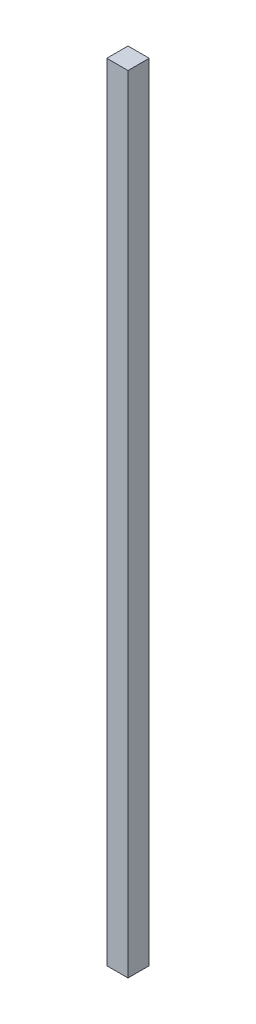
ISO-10303-21;
HEADER;
FILE_DESCRIPTION(('STEP AP214'),'2;1');
FILE_NAME('part.step','',(''),(''),'','','');
FILE_SCHEMA(('AUTOMOTIVE_DESIGN { 1 0 10303 214 1 1 1 1 }'));
ENDSEC;
DATA;
#1=APPLICATION_CONTEXT('core data for automotive mechanical design processes');
#2=APPLICATION_PROTOCOL_DEFINITION('international standard','automotive_design',2000,#1);
#3=PRODUCT_CONTEXT('',#1,'mechanical');
#4=PRODUCT('Part','Part','',(#3));
#5=PRODUCT_RELATED_PRODUCT_CATEGORY('part','',(#4));
#6=PRODUCT_DEFINITION_FORMATION('','',#4);
#7=PRODUCT_DEFINITION_CONTEXT('part definition',#1,'design');
#8=PRODUCT_DEFINITION('design','',#6,#7);
#9=PRODUCT_DEFINITION_SHAPE('','',#8);
#10=(LENGTH_UNIT() NAMED_UNIT(*) SI_UNIT(.MILLI.,.METRE.));
#11=(NAMED_UNIT(*) PLANE_ANGLE_UNIT() SI_UNIT($,.RADIAN.));
#12=(NAMED_UNIT(*) SI_UNIT($,.STERADIAN.) SOLID_ANGLE_UNIT());
#13=UNCERTAINTY_MEASURE_WITH_UNIT(LENGTH_MEASURE(1.E-05),#10,'distance_accuracy_value','');
#14=(GEOMETRIC_REPRESENTATION_CONTEXT(3) GLOBAL_UNCERTAINTY_ASSIGNED_CONTEXT((#13)) GLOBAL_UNIT_ASSIGNED_CONTEXT((#10,
#11,#12)) REPRESENTATION_CONTEXT('',''));
#15=CARTESIAN_POINT('',(0.,0.,0.));
#16=DIRECTION('',(0.,0.,1.));
#17=DIRECTION('',(1.,0.,0.));
#18=AXIS2_PLACEMENT_3D('',#15,#16,#17);
#19=CARTESIAN_POINT('',(0.,-370.,10.));
#20=DIRECTION('',(1.,0.,0.));
#21=DIRECTION('',(0.,0.,-1.));
#22=AXIS2_PLACEMENT_3D('',#19,#20,#21);
#23=PLANE('',#22);
#24=DIRECTION('',(0.,-1.,0.));
#25=VECTOR('',#24,1.);
#26=CARTESIAN_POINT('',(0.,-370.,0.));
#27=LINE('',#26,#25);
#28=CARTESIAN_POINT('',(0.,0.,0.));
#29=VERTEX_POINT('',#28);
#30=CARTESIAN_POINT('',(0.,-370.,0.));
#31=VERTEX_POINT('',#30);
#32=EDGE_CURVE('E107',#29,#31,#27,.T.);
#33=ORIENTED_EDGE('',*,*,#32,.T.);
#34=DIRECTION('',(0.,0.,-1.));
#35=VECTOR('',#34,1.);
#36=CARTESIAN_POINT('',(0.,-370.,10.));
#37=LINE('',#36,#35);
#38=CARTESIAN_POINT('',(0.,-370.,10.));
#39=VERTEX_POINT('',#38);
#40=EDGE_CURVE('E11',#39,#31,#37,.T.);
#41=ORIENTED_EDGE('',*,*,#40,.F.);
#42=DIRECTION('',(0.,-1.,0.));
#43=VECTOR('',#42,1.);
#44=CARTESIAN_POINT('',(0.,-370.,10.));
#45=LINE('',#44,#43);
#46=CARTESIAN_POINT('',(0.,0.,10.));
#47=VERTEX_POINT('',#46);
#48=EDGE_CURVE('E91',#47,#39,#45,.T.);
#49=ORIENTED_EDGE('',*,*,#48,.F.);
#50=DIRECTION('',(0.,0.,-1.));
#51=VECTOR('',#50,1.);
#52=CARTESIAN_POINT('',(0.,0.,10.));
#53=LINE('',#52,#51);
#54=EDGE_CURVE('E103',#47,#29,#53,.T.);
#55=ORIENTED_EDGE('',*,*,#54,.T.);
#56=EDGE_LOOP('',(#33,#41,#49,#55));
#57=FACE_BOUND('',#56,.T.);
#58=ADVANCED_FACE('F39',(#57),#23,.F.);
#59=CARTESIAN_POINT('',(10.,-370.,10.));
#60=DIRECTION('',(0.,1.,0.));
#61=DIRECTION('',(0.,0.,1.));
#62=AXIS2_PLACEMENT_3D('',#59,#60,#61);
#63=PLANE('',#62);
#64=DIRECTION('',(1.,0.,0.));
#65=VECTOR('',#64,1.);
#66=CARTESIAN_POINT('',(10.,-370.,0.));
#67=LINE('',#66,#65);
#68=CARTESIAN_POINT('',(10.,-370.,0.));
#69=VERTEX_POINT('',#68);
#70=EDGE_CURVE('E96',#31,#69,#67,.T.);
#71=ORIENTED_EDGE('',*,*,#70,.T.);
#72=DIRECTION('',(0.,0.,-1.));
#73=VECTOR('',#72,1.);
#74=CARTESIAN_POINT('',(10.,-370.,10.));
#75=LINE('',#74,#73);
#76=CARTESIAN_POINT('',(10.,-370.,10.));
#77=VERTEX_POINT('',#76);
#78=EDGE_CURVE('E48',#77,#69,#75,.T.);
#79=ORIENTED_EDGE('',*,*,#78,.F.);
#80=DIRECTION('',(1.,0.,0.));
#81=VECTOR('',#80,1.);
#82=CARTESIAN_POINT('',(10.,-370.,10.));
#83=LINE('',#82,#81);
#84=EDGE_CURVE('E86',#39,#77,#83,.T.);
#85=ORIENTED_EDGE('',*,*,#84,.F.);
#86=ORIENTED_EDGE('',*,*,#40,.T.);
#87=EDGE_LOOP('',(#71,#79,#85,#86));
#88=FACE_BOUND('',#87,.T.);
#89=ADVANCED_FACE('F95',(#88),#63,.F.);
#90=CARTESIAN_POINT('',(10.,0.,10.));
#91=DIRECTION('',(-1.,0.,0.));
#92=DIRECTION('',(0.,-1.,0.));
#93=AXIS2_PLACEMENT_3D('',#90,#91,#92);
#94=PLANE('',#93);
#95=DIRECTION('',(0.,1.,0.));
#96=VECTOR('',#95,1.);
#97=CARTESIAN_POINT('',(10.,0.,0.));
#98=LINE('',#97,#96);
#99=CARTESIAN_POINT('',(10.,0.,0.));
#100=VERTEX_POINT('',#99);
#101=EDGE_CURVE('E73',#69,#100,#98,.T.);
#102=ORIENTED_EDGE('',*,*,#101,.T.);
#103=DIRECTION('',(0.,0.,-1.));
#104=VECTOR('',#103,1.);
#105=CARTESIAN_POINT('',(10.,0.,10.));
#106=LINE('',#105,#104);
#107=CARTESIAN_POINT('',(10.,0.,10.));
#108=VERTEX_POINT('',#107);
#109=EDGE_CURVE('E98',#108,#100,#106,.T.);
#110=ORIENTED_EDGE('',*,*,#109,.F.);
#111=DIRECTION('',(0.,1.,0.));
#112=VECTOR('',#111,1.);
#113=CARTESIAN_POINT('',(10.,0.,10.));
#114=LINE('',#113,#112);
#115=EDGE_CURVE('E89',#77,#108,#114,.T.);
#116=ORIENTED_EDGE('',*,*,#115,.F.);
#117=ORIENTED_EDGE('',*,*,#78,.T.);
#118=EDGE_LOOP('',(#102,#110,#116,#117));
#119=FACE_BOUND('',#118,.T.);
#120=ADVANCED_FACE('F99',(#119),#94,.F.);
#121=CARTESIAN_POINT('',(0.,0.,10.));
#122=DIRECTION('',(0.,-1.,0.));
#123=DIRECTION('',(0.,0.,-1.));
#124=AXIS2_PLACEMENT_3D('',#121,#122,#123);
#125=PLANE('',#124);
#126=DIRECTION('',(-1.,0.,0.));
#127=VECTOR('',#126,1.);
#128=CARTESIAN_POINT('',(0.,0.,0.));
#129=LINE('',#128,#127);
#130=EDGE_CURVE('E79',#100,#29,#129,.T.);
#131=ORIENTED_EDGE('',*,*,#130,.T.);
#132=ORIENTED_EDGE('',*,*,#54,.F.);
#133=DIRECTION('',(-1.,0.,0.));
#134=VECTOR('',#133,1.);
#135=CARTESIAN_POINT('',(0.,0.,10.));
#136=LINE('',#135,#134);
#137=EDGE_CURVE('E56',#108,#47,#136,.T.);
#138=ORIENTED_EDGE('',*,*,#137,.F.);
#139=ORIENTED_EDGE('',*,*,#109,.T.);
#140=EDGE_LOOP('',(#131,#132,#138,#139));
#141=FACE_BOUND('',#140,.T.);
#142=ADVANCED_FACE('F120',(#141),#125,.F.);
#143=CARTESIAN_POINT('',(0.,0.,10.));
#144=DIRECTION('',(0.,0.,-1.));
#145=DIRECTION('',(-1.,0.,0.));
#146=AXIS2_PLACEMENT_3D('',#143,#144,#145);
#147=PLANE('',#146);
#148=ORIENTED_EDGE('',*,*,#48,.T.);
#149=ORIENTED_EDGE('',*,*,#84,.T.);
#150=ORIENTED_EDGE('',*,*,#115,.T.);
#151=ORIENTED_EDGE('',*,*,#137,.T.);
#152=EDGE_LOOP('',(#148,#149,#150,#151));
#153=FACE_BOUND('',#152,.T.);
#154=ADVANCED_FACE('F87',(#153),#147,.F.);
#155=CARTESIAN_POINT('',(0.,0.,0.));
#156=DIRECTION('',(0.,0.,-1.));
#157=DIRECTION('',(-1.,0.,0.));
#158=AXIS2_PLACEMENT_3D('',#155,#156,#157);
#159=PLANE('',#158);
#160=ORIENTED_EDGE('',*,*,#32,.F.);
#161=ORIENTED_EDGE('',*,*,#130,.F.);
#162=ORIENTED_EDGE('',*,*,#101,.F.);
#163=ORIENTED_EDGE('',*,*,#70,.F.);
#164=EDGE_LOOP('',(#160,#161,#162,#163));
#165=FACE_BOUND('',#164,.T.);
#166=ADVANCED_FACE('F123',(#165),#159,.T.);
#167=CLOSED_SHELL('',(#58,#89,#120,#142,#154,#166));
#168=MANIFOLD_SOLID_BREP('B2',#167);
#169=ADVANCED_BREP_SHAPE_REPRESENTATION('',(#18,#168),#14);
#170=SHAPE_DEFINITION_REPRESENTATION(#9,#169);
ENDSEC;
END-ISO-10303-21;
